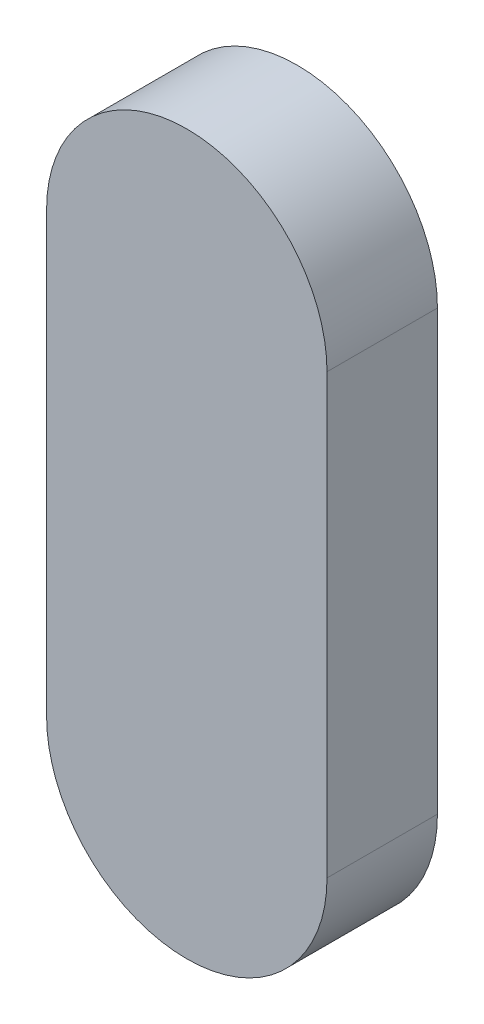
ISO-10303-21;
HEADER;
FILE_DESCRIPTION(('STEP AP214'),'2;1');
FILE_NAME('part.step','',(''),(''),'','','');
FILE_SCHEMA(('AUTOMOTIVE_DESIGN { 1 0 10303 214 1 1 1 1 }'));
ENDSEC;
DATA;
#1=APPLICATION_CONTEXT('core data for automotive mechanical design processes');
#2=APPLICATION_PROTOCOL_DEFINITION('international standard','automotive_design',2000,#1);
#3=PRODUCT_CONTEXT('',#1,'mechanical');
#4=PRODUCT('Part','Part','',(#3));
#5=PRODUCT_RELATED_PRODUCT_CATEGORY('part','',(#4));
#6=PRODUCT_DEFINITION_FORMATION('','',#4);
#7=PRODUCT_DEFINITION_CONTEXT('part definition',#1,'design');
#8=PRODUCT_DEFINITION('design','',#6,#7);
#9=PRODUCT_DEFINITION_SHAPE('','',#8);
#10=(LENGTH_UNIT() NAMED_UNIT(*) SI_UNIT(.MILLI.,.METRE.));
#11=(NAMED_UNIT(*) PLANE_ANGLE_UNIT() SI_UNIT($,.RADIAN.));
#12=(NAMED_UNIT(*) SI_UNIT($,.STERADIAN.) SOLID_ANGLE_UNIT());
#13=UNCERTAINTY_MEASURE_WITH_UNIT(LENGTH_MEASURE(1.E-05),#10,'distance_accuracy_value','');
#14=(GEOMETRIC_REPRESENTATION_CONTEXT(3) GLOBAL_UNCERTAINTY_ASSIGNED_CONTEXT((#13)) GLOBAL_UNIT_ASSIGNED_CONTEXT((#10,
#11,#12)) REPRESENTATION_CONTEXT('',''));
#15=CARTESIAN_POINT('',(0.,0.,0.));
#16=DIRECTION('',(0.,0.,1.));
#17=DIRECTION('',(1.,0.,0.));
#18=AXIS2_PLACEMENT_3D('',#15,#16,#17);
#19=CARTESIAN_POINT('',(92.0044896,66.3205176,0.));
#20=DIRECTION('',(-1.,0.,0.));
#21=DIRECTION('',(0.,1.,0.));
#22=AXIS2_PLACEMENT_3D('',#19,#20,#21);
#23=PLANE('',#22);
#24=DIRECTION('',(0.,1.,0.));
#25=VECTOR('',#24,1.);
#26=CARTESIAN_POINT('',(92.0044896,66.3205176,0.1999996));
#27=LINE('',#26,#25);
#28=CARTESIAN_POINT('',(92.0044896,66.3205176,0.1999996));
#29=VERTEX_POINT('',#28);
#30=CARTESIAN_POINT('',(92.0044896,67.1145724,0.1999996));
#31=VERTEX_POINT('',#30);
#32=EDGE_CURVE('E11',#29,#31,#27,.T.);
#33=ORIENTED_EDGE('',*,*,#32,.F.);
#34=DIRECTION('',(0.,0.,1.));
#35=VECTOR('',#34,1.);
#36=CARTESIAN_POINT('',(92.0044896,66.3205176,0.));
#37=LINE('',#36,#35);
#38=CARTESIAN_POINT('',(92.0044896,66.3205176,0.));
#39=VERTEX_POINT('',#38);
#40=EDGE_CURVE('E24',#39,#29,#37,.T.);
#41=ORIENTED_EDGE('',*,*,#40,.F.);
#42=DIRECTION('',(0.,1.,0.));
#43=VECTOR('',#42,1.);
#44=CARTESIAN_POINT('',(92.0044896,66.3205176,0.));
#45=LINE('',#44,#43);
#46=CARTESIAN_POINT('',(92.0044896,67.1145724,0.));
#47=VERTEX_POINT('',#46);
#48=EDGE_CURVE('E75',#39,#47,#45,.T.);
#49=ORIENTED_EDGE('',*,*,#48,.T.);
#50=DIRECTION('',(0.,0.,1.));
#51=VECTOR('',#50,1.);
#52=CARTESIAN_POINT('',(92.0044896,67.1145724,0.));
#53=LINE('',#52,#51);
#54=EDGE_CURVE('E37',#47,#31,#53,.T.);
#55=ORIENTED_EDGE('',*,*,#54,.T.);
#56=EDGE_LOOP('',(#33,#41,#49,#55));
#57=FACE_BOUND('',#56,.T.);
#58=ADVANCED_FACE('F17',(#57),#23,.F.);
#59=CARTESIAN_POINT('',(91.7504896,67.1145724,0.));
#60=DIRECTION('',(0.,0.,-1.));
#61=DIRECTION('',(1.,0.,0.));
#62=AXIS2_PLACEMENT_3D('',#59,#60,#61);
#63=CYLINDRICAL_SURFACE('',#62,0.254);
#64=CARTESIAN_POINT('',(91.7504896,67.1145724,0.1999996));
#65=DIRECTION('',(0.,0.,1.));
#66=DIRECTION('',(1.,0.,0.));
#67=AXIS2_PLACEMENT_3D('',#64,#65,#66);
#68=CIRCLE('',#67,0.254);
#69=CARTESIAN_POINT('',(91.4964896,67.1145724,0.1999996));
#70=VERTEX_POINT('',#69);
#71=EDGE_CURVE('E83',#31,#70,#68,.T.);
#72=ORIENTED_EDGE('',*,*,#71,.F.);
#73=ORIENTED_EDGE('',*,*,#54,.F.);
#74=CARTESIAN_POINT('',(91.7504896,67.1145724,0.));
#75=DIRECTION('',(0.,0.,1.));
#76=DIRECTION('',(1.,0.,0.));
#77=AXIS2_PLACEMENT_3D('',#74,#75,#76);
#78=CIRCLE('',#77,0.254);
#79=CARTESIAN_POINT('',(91.4964896,67.1145724,0.));
#80=VERTEX_POINT('',#79);
#81=EDGE_CURVE('E81',#47,#80,#78,.T.);
#82=ORIENTED_EDGE('',*,*,#81,.T.);
#83=DIRECTION('',(0.,0.,1.));
#84=VECTOR('',#83,1.);
#85=CARTESIAN_POINT('',(91.4964896,67.1145724,0.));
#86=LINE('',#85,#84);
#87=EDGE_CURVE('E67',#80,#70,#86,.T.);
#88=ORIENTED_EDGE('',*,*,#87,.T.);
#89=EDGE_LOOP('',(#72,#73,#82,#88));
#90=FACE_BOUND('',#89,.T.);
#91=ADVANCED_FACE('F89',(#90),#63,.T.);
#92=CARTESIAN_POINT('',(91.4964896,67.1145724,0.));
#93=DIRECTION('',(1.,0.,0.));
#94=DIRECTION('',(0.,-1.,0.));
#95=AXIS2_PLACEMENT_3D('',#92,#93,#94);
#96=PLANE('',#95);
#97=DIRECTION('',(0.,-1.,0.));
#98=VECTOR('',#97,1.);
#99=CARTESIAN_POINT('',(91.4964896,67.1145724,0.1999996));
#100=LINE('',#99,#98);
#101=CARTESIAN_POINT('',(91.4964896,66.3205176,0.1999996));
#102=VERTEX_POINT('',#101);
#103=EDGE_CURVE('E71',#70,#102,#100,.T.);
#104=ORIENTED_EDGE('',*,*,#103,.F.);
#105=ORIENTED_EDGE('',*,*,#87,.F.);
#106=DIRECTION('',(0.,-1.,0.));
#107=VECTOR('',#106,1.);
#108=CARTESIAN_POINT('',(91.4964896,67.1145724,0.));
#109=LINE('',#108,#107);
#110=CARTESIAN_POINT('',(91.4964896,66.3205176,0.));
#111=VERTEX_POINT('',#110);
#112=EDGE_CURVE('E63',#80,#111,#109,.T.);
#113=ORIENTED_EDGE('',*,*,#112,.T.);
#114=DIRECTION('',(0.,0.,1.));
#115=VECTOR('',#114,1.);
#116=CARTESIAN_POINT('',(91.4964896,66.3205176,0.));
#117=LINE('',#116,#115);
#118=EDGE_CURVE('E53',#111,#102,#117,.T.);
#119=ORIENTED_EDGE('',*,*,#118,.T.);
#120=EDGE_LOOP('',(#104,#105,#113,#119));
#121=FACE_BOUND('',#120,.T.);
#122=ADVANCED_FACE('F66',(#121),#96,.F.);
#123=CARTESIAN_POINT('',(91.7504896,66.3205176,0.));
#124=DIRECTION('',(0.,0.,-1.));
#125=DIRECTION('',(-1.,0.,0.));
#126=AXIS2_PLACEMENT_3D('',#123,#124,#125);
#127=CYLINDRICAL_SURFACE('',#126,0.254000000000005);
#128=CARTESIAN_POINT('',(91.7504896,66.3205176,0.1999996));
#129=DIRECTION('',(0.,0.,1.));
#130=DIRECTION('',(-1.,0.,0.));
#131=AXIS2_PLACEMENT_3D('',#128,#129,#130);
#132=CIRCLE('',#131,0.254000000000005);
#133=EDGE_CURVE('E59',#102,#29,#132,.T.);
#134=ORIENTED_EDGE('',*,*,#133,.F.);
#135=ORIENTED_EDGE('',*,*,#118,.F.);
#136=CARTESIAN_POINT('',(91.7504896,66.3205176,0.));
#137=DIRECTION('',(0.,0.,1.));
#138=DIRECTION('',(-1.,0.,0.));
#139=AXIS2_PLACEMENT_3D('',#136,#137,#138);
#140=CIRCLE('',#139,0.254000000000005);
#141=EDGE_CURVE('E57',#111,#39,#140,.T.);
#142=ORIENTED_EDGE('',*,*,#141,.T.);
#143=ORIENTED_EDGE('',*,*,#40,.T.);
#144=EDGE_LOOP('',(#134,#135,#142,#143));
#145=FACE_BOUND('',#144,.T.);
#146=ADVANCED_FACE('F55',(#145),#127,.T.);
#147=CARTESIAN_POINT('',(92.0044896,66.3205176,0.));
#148=DIRECTION('',(0.,0.,-1.));
#149=DIRECTION('',(-1.,0.,0.));
#150=AXIS2_PLACEMENT_3D('',#147,#148,#149);
#151=PLANE('',#150);
#152=ORIENTED_EDGE('',*,*,#141,.F.);
#153=ORIENTED_EDGE('',*,*,#112,.F.);
#154=ORIENTED_EDGE('',*,*,#81,.F.);
#155=ORIENTED_EDGE('',*,*,#48,.F.);
#156=EDGE_LOOP('',(#152,#153,#154,#155));
#157=FACE_BOUND('',#156,.T.);
#158=ADVANCED_FACE('F74',(#157),#151,.T.);
#159=CARTESIAN_POINT('',(92.0044896,66.3205176,0.1999996));
#160=DIRECTION('',(0.,0.,-1.));
#161=DIRECTION('',(-1.,0.,0.));
#162=AXIS2_PLACEMENT_3D('',#159,#160,#161);
#163=PLANE('',#162);
#164=ORIENTED_EDGE('',*,*,#32,.T.);
#165=ORIENTED_EDGE('',*,*,#71,.T.);
#166=ORIENTED_EDGE('',*,*,#103,.T.);
#167=ORIENTED_EDGE('',*,*,#133,.T.);
#168=EDGE_LOOP('',(#164,#165,#166,#167));
#169=FACE_BOUND('',#168,.T.);
#170=ADVANCED_FACE('F91',(#169),#163,.F.);
#171=CLOSED_SHELL('',(#58,#91,#122,#146,#158,#170));
#172=MANIFOLD_SOLID_BREP('B1',#171);
#173=ADVANCED_BREP_SHAPE_REPRESENTATION('',(#18,#172),#14);
#174=SHAPE_DEFINITION_REPRESENTATION(#9,#173);
ENDSEC;
END-ISO-10303-21;
